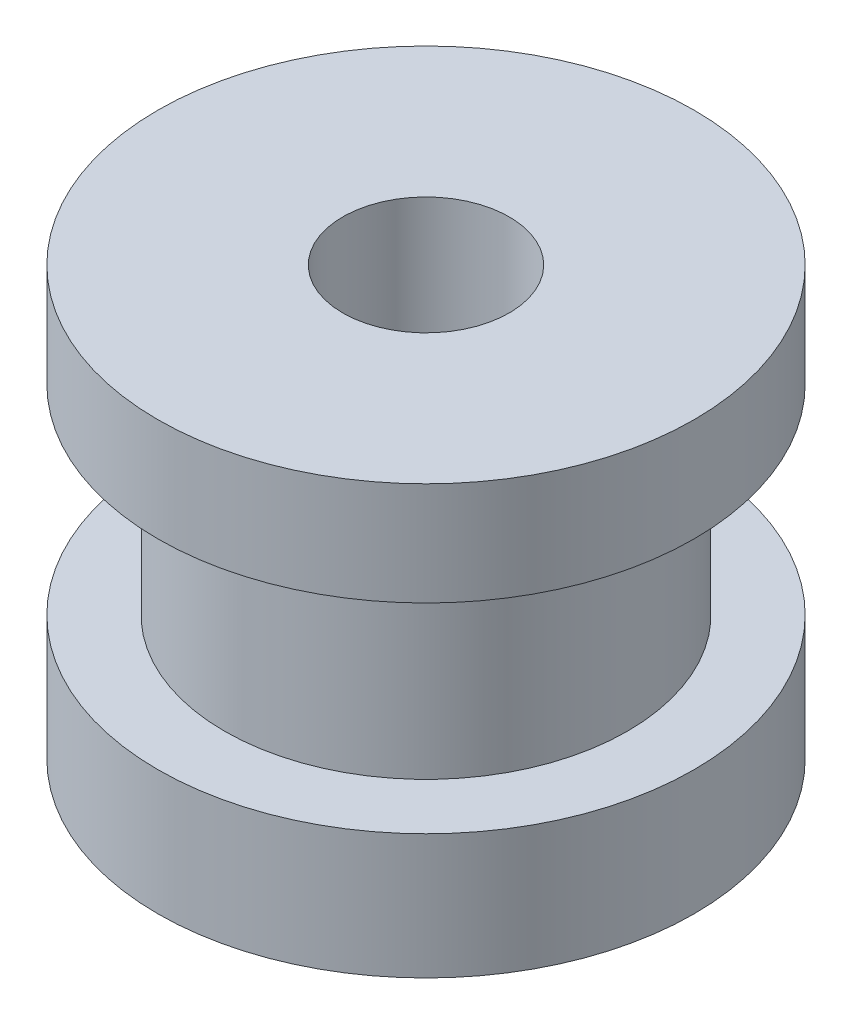
ISO-10303-21;
HEADER;
FILE_DESCRIPTION(('STEP AP214'),'2;1');
FILE_NAME('part.step','',(''),(''),'','','');
FILE_SCHEMA(('AUTOMOTIVE_DESIGN { 1 0 10303 214 1 1 1 1 }'));
ENDSEC;
DATA;
#1=APPLICATION_CONTEXT('core data for automotive mechanical design processes');
#2=APPLICATION_PROTOCOL_DEFINITION('international standard','automotive_design',2000,#1);
#3=PRODUCT_CONTEXT('',#1,'mechanical');
#4=PRODUCT('Part','Part','',(#3));
#5=PRODUCT_RELATED_PRODUCT_CATEGORY('part','',(#4));
#6=PRODUCT_DEFINITION_FORMATION('','',#4);
#7=PRODUCT_DEFINITION_CONTEXT('part definition',#1,'design');
#8=PRODUCT_DEFINITION('design','',#6,#7);
#9=PRODUCT_DEFINITION_SHAPE('','',#8);
#10=(LENGTH_UNIT() NAMED_UNIT(*) SI_UNIT(.MILLI.,.METRE.));
#11=(NAMED_UNIT(*) PLANE_ANGLE_UNIT() SI_UNIT($,.RADIAN.));
#12=(NAMED_UNIT(*) SI_UNIT($,.STERADIAN.) SOLID_ANGLE_UNIT());
#13=UNCERTAINTY_MEASURE_WITH_UNIT(LENGTH_MEASURE(1.E-05),#10,'distance_accuracy_value','');
#14=(GEOMETRIC_REPRESENTATION_CONTEXT(3) GLOBAL_UNCERTAINTY_ASSIGNED_CONTEXT((#13)) GLOBAL_UNIT_ASSIGNED_CONTEXT((#10,
#11,#12)) REPRESENTATION_CONTEXT('',''));
#15=CARTESIAN_POINT('',(0.,0.,0.));
#16=DIRECTION('',(0.,0.,1.));
#17=DIRECTION('',(1.,0.,0.));
#18=AXIS2_PLACEMENT_3D('',#15,#16,#17);
#19=CARTESIAN_POINT('',(0.,6.,0.));
#20=DIRECTION('',(0.,-1.,0.));
#21=DIRECTION('',(0.,0.,-1.));
#22=AXIS2_PLACEMENT_3D('',#19,#20,#21);
#23=CYLINDRICAL_SURFACE('',#22,2.1);
#24=CARTESIAN_POINT('',(0.,0.,0.));
#25=DIRECTION('',(0.,-1.,0.));
#26=DIRECTION('',(0.,0.,-1.));
#27=AXIS2_PLACEMENT_3D('',#24,#25,#26);
#28=CIRCLE('',#27,2.1);
#29=CARTESIAN_POINT('',(0.,0.,-2.1));
#30=VERTEX_POINT('',#29);
#31=EDGE_CURVE('E54',#30,#30,#28,.T.);
#32=ORIENTED_EDGE('',*,*,#31,.T.);
#33=EDGE_LOOP('',(#32));
#34=FACE_BOUND('',#33,.T.);
#35=CARTESIAN_POINT('',(0.,5.85,0.));
#36=DIRECTION('',(0.,1.,0.));
#37=DIRECTION('',(0.,0.,1.));
#38=AXIS2_PLACEMENT_3D('',#35,#36,#37);
#39=CIRCLE('',#38,2.1);
#40=CARTESIAN_POINT('',(0.,5.85,2.1));
#41=VERTEX_POINT('',#40);
#42=EDGE_CURVE('E34',#41,#41,#39,.F.);
#43=ORIENTED_EDGE('',*,*,#42,.F.);
#44=EDGE_LOOP('',(#43));
#45=FACE_BOUND('',#44,.T.);
#46=ADVANCED_FACE('F30',(#34,#45),#23,.F.);
#47=CARTESIAN_POINT('',(0.,3.75,0.));
#48=DIRECTION('',(0.,1.,0.));
#49=DIRECTION('',(0.,0.,1.));
#50=AXIS2_PLACEMENT_3D('',#47,#48,#49);
#51=PLANE('',#50);
#52=CARTESIAN_POINT('',(0.,3.75,0.));
#53=DIRECTION('',(0.,1.,0.));
#54=DIRECTION('',(0.,0.,1.));
#55=AXIS2_PLACEMENT_3D('',#52,#53,#54);
#56=CIRCLE('',#55,8.05);
#57=CARTESIAN_POINT('',(0.,3.75,8.05));
#58=VERTEX_POINT('',#57);
#59=EDGE_CURVE('E10',#58,#58,#56,.T.);
#60=ORIENTED_EDGE('',*,*,#59,.T.);
#61=EDGE_LOOP('',(#60));
#62=FACE_BOUND('',#61,.T.);
#63=CARTESIAN_POINT('',(0.,3.75,0.));
#64=DIRECTION('',(0.,1.,0.));
#65=DIRECTION('',(0.,0.,1.));
#66=AXIS2_PLACEMENT_3D('',#63,#64,#65);
#67=CIRCLE('',#66,6.05);
#68=CARTESIAN_POINT('',(0.,3.75,6.05));
#69=VERTEX_POINT('',#68);
#70=EDGE_CURVE('E45',#69,#69,#67,.T.);
#71=ORIENTED_EDGE('',*,*,#70,.F.);
#72=EDGE_LOOP('',(#71));
#73=FACE_BOUND('',#72,.T.);
#74=ADVANCED_FACE('F72',(#62,#73),#51,.T.);
#75=CARTESIAN_POINT('',(0.,3.75,0.));
#76=DIRECTION('',(0.,-1.,0.));
#77=DIRECTION('',(0.,0.,-1.));
#78=AXIS2_PLACEMENT_3D('',#75,#76,#77);
#79=CYLINDRICAL_SURFACE('',#78,8.05);
#80=ORIENTED_EDGE('',*,*,#59,.F.);
#81=EDGE_LOOP('',(#80));
#82=FACE_BOUND('',#81,.T.);
#83=CARTESIAN_POINT('',(0.,0.,0.));
#84=DIRECTION('',(0.,1.,0.));
#85=DIRECTION('',(0.,0.,1.));
#86=AXIS2_PLACEMENT_3D('',#83,#84,#85);
#87=CIRCLE('',#86,8.05);
#88=CARTESIAN_POINT('',(0.,0.,8.05));
#89=VERTEX_POINT('',#88);
#90=EDGE_CURVE('E38',#89,#89,#87,.T.);
#91=ORIENTED_EDGE('',*,*,#90,.T.);
#92=EDGE_LOOP('',(#91));
#93=FACE_BOUND('',#92,.T.);
#94=ADVANCED_FACE('F32',(#82,#93),#79,.T.);
#95=CARTESIAN_POINT('',(0.,0.,0.));
#96=DIRECTION('',(0.,1.,0.));
#97=DIRECTION('',(0.,0.,1.));
#98=AXIS2_PLACEMENT_3D('',#95,#96,#97);
#99=PLANE('',#98);
#100=ORIENTED_EDGE('',*,*,#31,.F.);
#101=EDGE_LOOP('',(#100));
#102=FACE_BOUND('',#101,.T.);
#103=ORIENTED_EDGE('',*,*,#90,.F.);
#104=EDGE_LOOP('',(#103));
#105=FACE_BOUND('',#104,.T.);
#106=ADVANCED_FACE('F97',(#102,#105),#99,.F.);
#107=CARTESIAN_POINT('',(0.,9.75,0.));
#108=DIRECTION('',(0.,-1.,0.));
#109=DIRECTION('',(0.,0.,-1.));
#110=AXIS2_PLACEMENT_3D('',#107,#108,#109);
#111=CYLINDRICAL_SURFACE('',#110,6.05);
#112=CARTESIAN_POINT('',(0.,9.75,0.));
#113=DIRECTION('',(0.,1.,0.));
#114=DIRECTION('',(0.,0.,1.));
#115=AXIS2_PLACEMENT_3D('',#112,#113,#114);
#116=CIRCLE('',#115,6.05);
#117=CARTESIAN_POINT('',(0.,9.75,6.05));
#118=VERTEX_POINT('',#117);
#119=EDGE_CURVE('E43',#118,#118,#116,.T.);
#120=ORIENTED_EDGE('',*,*,#119,.F.);
#121=EDGE_LOOP('',(#120));
#122=FACE_BOUND('',#121,.T.);
#123=ORIENTED_EDGE('',*,*,#70,.T.);
#124=EDGE_LOOP('',(#123));
#125=FACE_BOUND('',#124,.T.);
#126=ADVANCED_FACE('F91',(#122,#125),#111,.T.);
#127=CARTESIAN_POINT('',(0.,9.75,0.));
#128=DIRECTION('',(0.,1.,0.));
#129=DIRECTION('',(0.,0.,1.));
#130=AXIS2_PLACEMENT_3D('',#127,#128,#129);
#131=PLANE('',#130);
#132=CARTESIAN_POINT('',(0.,9.75,0.));
#133=DIRECTION('',(0.,1.,0.));
#134=DIRECTION('',(0.,0.,1.));
#135=AXIS2_PLACEMENT_3D('',#132,#133,#134);
#136=CIRCLE('',#135,8.05);
#137=CARTESIAN_POINT('',(0.,9.75,-8.05));
#138=VERTEX_POINT('',#137);
#139=EDGE_CURVE('E51',#138,#138,#136,.T.);
#140=ORIENTED_EDGE('',*,*,#139,.F.);
#141=EDGE_LOOP('',(#140));
#142=FACE_BOUND('',#141,.T.);
#143=ORIENTED_EDGE('',*,*,#119,.T.);
#144=EDGE_LOOP('',(#143));
#145=FACE_BOUND('',#144,.T.);
#146=ADVANCED_FACE('F88',(#142,#145),#131,.F.);
#147=CARTESIAN_POINT('',(0.,12.85,0.));
#148=DIRECTION('',(0.,-1.,0.));
#149=DIRECTION('',(0.,0.,-1.));
#150=AXIS2_PLACEMENT_3D('',#147,#148,#149);
#151=CYLINDRICAL_SURFACE('',#150,8.05);
#152=CARTESIAN_POINT('',(0.,12.85,0.));
#153=DIRECTION('',(0.,1.,0.));
#154=DIRECTION('',(0.,0.,1.));
#155=AXIS2_PLACEMENT_3D('',#152,#153,#154);
#156=CIRCLE('',#155,8.05);
#157=CARTESIAN_POINT('',(0.,12.85,-8.05));
#158=VERTEX_POINT('',#157);
#159=EDGE_CURVE('E48',#158,#158,#156,.T.);
#160=CARTESIAN_POINT('',(0.,12.85,-8.05));
#161=CARTESIAN_POINT('',(0.,12.8177083333333,-8.05));
#162=CARTESIAN_POINT('',(0.,12.7854166666667,-8.05));
#163=CARTESIAN_POINT('',(0.,12.7208333333333,-8.05));
#164=CARTESIAN_POINT('',(0.,12.6885416666667,-8.05));
#165=CARTESIAN_POINT('',(0.,12.6239583333333,-8.05));
#166=CARTESIAN_POINT('',(0.,12.5916666666667,-8.05));
#167=CARTESIAN_POINT('',(0.,12.5270833333333,-8.05));
#168=CARTESIAN_POINT('',(0.,12.4947916666667,-8.05));
#169=CARTESIAN_POINT('',(0.,12.4302083333333,-8.05));
#170=CARTESIAN_POINT('',(0.,12.3979166666667,-8.05));
#171=CARTESIAN_POINT('',(0.,12.3333333333333,-8.05));
#172=CARTESIAN_POINT('',(0.,12.3010416666667,-8.05));
#173=CARTESIAN_POINT('',(0.,12.2364583333333,-8.05));
#174=CARTESIAN_POINT('',(0.,12.2041666666667,-8.05));
#175=CARTESIAN_POINT('',(0.,12.1395833333333,-8.05));
#176=CARTESIAN_POINT('',(0.,12.1072916666667,-8.05));
#177=CARTESIAN_POINT('',(0.,12.0427083333333,-8.05));
#178=CARTESIAN_POINT('',(0.,12.0104166666667,-8.05));
#179=CARTESIAN_POINT('',(0.,11.9458333333333,-8.05));
#180=CARTESIAN_POINT('',(0.,11.9135416666667,-8.05));
#181=CARTESIAN_POINT('',(0.,11.8489583333333,-8.05));
#182=CARTESIAN_POINT('',(0.,11.8166666666667,-8.05));
#183=CARTESIAN_POINT('',(0.,11.7520833333333,-8.05));
#184=CARTESIAN_POINT('',(0.,11.7197916666667,-8.05));
#185=CARTESIAN_POINT('',(0.,11.6552083333333,-8.05));
#186=CARTESIAN_POINT('',(0.,11.6229166666667,-8.05));
#187=CARTESIAN_POINT('',(0.,11.5583333333333,-8.05));
#188=CARTESIAN_POINT('',(0.,11.5260416666667,-8.05));
#189=CARTESIAN_POINT('',(0.,11.4614583333333,-8.05));
#190=CARTESIAN_POINT('',(0.,11.4291666666667,-8.05));
#191=CARTESIAN_POINT('',(0.,11.3645833333333,-8.05));
#192=CARTESIAN_POINT('',(0.,11.3322916666667,-8.05));
#193=CARTESIAN_POINT('',(0.,11.2677083333333,-8.05));
#194=CARTESIAN_POINT('',(0.,11.2354166666667,-8.05));
#195=CARTESIAN_POINT('',(0.,11.1708333333333,-8.05));
#196=CARTESIAN_POINT('',(0.,11.1385416666667,-8.05));
#197=CARTESIAN_POINT('',(0.,11.0739583333333,-8.05));
#198=CARTESIAN_POINT('',(0.,11.0416666666667,-8.05));
#199=CARTESIAN_POINT('',(0.,10.9770833333333,-8.05));
#200=CARTESIAN_POINT('',(0.,10.9447916666667,-8.05));
#201=CARTESIAN_POINT('',(0.,10.8802083333333,-8.05));
#202=CARTESIAN_POINT('',(0.,10.8479166666667,-8.05));
#203=CARTESIAN_POINT('',(0.,10.7833333333333,-8.05));
#204=CARTESIAN_POINT('',(0.,10.7510416666667,-8.05));
#205=CARTESIAN_POINT('',(0.,10.6864583333333,-8.05));
#206=CARTESIAN_POINT('',(0.,10.6541666666667,-8.05));
#207=CARTESIAN_POINT('',(0.,10.5895833333333,-8.05));
#208=CARTESIAN_POINT('',(0.,10.5572916666667,-8.05));
#209=CARTESIAN_POINT('',(0.,10.4927083333333,-8.05));
#210=CARTESIAN_POINT('',(0.,10.4604166666667,-8.05));
#211=CARTESIAN_POINT('',(0.,10.3958333333333,-8.05));
#212=CARTESIAN_POINT('',(0.,10.3635416666667,-8.05));
#213=CARTESIAN_POINT('',(0.,10.2989583333333,-8.05));
#214=CARTESIAN_POINT('',(0.,10.2666666666667,-8.05));
#215=CARTESIAN_POINT('',(0.,10.2020833333333,-8.05));
#216=CARTESIAN_POINT('',(0.,10.1697916666667,-8.05));
#217=CARTESIAN_POINT('',(0.,10.1052083333333,-8.05));
#218=CARTESIAN_POINT('',(0.,10.0729166666667,-8.05));
#219=CARTESIAN_POINT('',(0.,10.0083333333333,-8.05));
#220=CARTESIAN_POINT('',(0.,9.97604166666667,-8.05));
#221=CARTESIAN_POINT('',(0.,9.91145833333333,-8.05));
#222=CARTESIAN_POINT('',(0.,9.87916666666667,-8.05));
#223=CARTESIAN_POINT('',(0.,9.81458333333333,-8.05));
#224=CARTESIAN_POINT('',(0.,9.78229166666667,-8.05));
#225=CARTESIAN_POINT('',(0.,9.75,-8.05));
#226=B_SPLINE_CURVE_WITH_KNOTS('',3,(#160,#161,#162,#163,#164,#165,#166,#167,#168,#169,#170,
#171,#172,#173,#174,#175,#176,#177,#178,#179,#180,#181,#182,#183,#184,#185,#186,#187,#188,#189,
#190,#191,#192,#193,#194,#195,#196,#197,#198,#199,#200,#201,#202,#203,#204,#205,#206,#207,#208,
#209,#210,#211,#212,#213,#214,#215,#216,#217,#218,#219,#220,#221,#222,#223,#224,#225),
.UNSPECIFIED.,.F.,.F.,(4,2,2,2,2,2,2,2,2,2,2,2,2,2,2,2,2,2,2,2,2,2,2,2,2,2,2,2,2,2,2,2,4),(0.,
0.0968749999999997,0.193749999999999,0.290624999999999,0.387499999999999,0.484374999999999,
0.581249999999998,0.678125,0.775,0.871874999999999,0.968749999999999,1.065625,1.1625,1.259375,
1.35625,1.453125,1.55,1.646875,1.74375,1.840625,1.9375,2.034375,2.13125,2.228125,2.325,2.421875,
2.51875,2.615625,2.7125,2.809375,2.90625,3.003125,3.1),.UNSPECIFIED.);
#227=EDGE_CURVE('BSEAM86',#158,#138,#226,.T.);
#228=ORIENTED_EDGE('',*,*,#159,.F.);
#229=ORIENTED_EDGE('',*,*,#139,.T.);
#230=ORIENTED_EDGE('',*,*,#227,.T.);
#231=ORIENTED_EDGE('',*,*,#227,.F.);
#232=EDGE_LOOP('',(#228,#230,#229,#231));
#233=FACE_BOUND('',#232,.T.);
#234=ADVANCED_FACE('F86',(#233),#151,.T.);
#235=CARTESIAN_POINT('',(0.,12.85,0.));
#236=DIRECTION('',(0.,1.,0.));
#237=DIRECTION('',(0.,0.,1.));
#238=AXIS2_PLACEMENT_3D('',#235,#236,#237);
#239=PLANE('',#238);
#240=CARTESIAN_POINT('',(0.,12.85,0.));
#241=DIRECTION('',(0.,1.,0.));
#242=DIRECTION('',(0.,0.,1.));
#243=AXIS2_PLACEMENT_3D('',#240,#241,#242);
#244=CIRCLE('',#243,2.5);
#245=CARTESIAN_POINT('',(0.,12.85,2.5));
#246=VERTEX_POINT('',#245);
#247=EDGE_CURVE('E59',#246,#246,#244,.T.);
#248=ORIENTED_EDGE('',*,*,#247,.F.);
#249=EDGE_LOOP('',(#248));
#250=FACE_BOUND('',#249,.T.);
#251=ORIENTED_EDGE('',*,*,#159,.T.);
#252=EDGE_LOOP('',(#251));
#253=FACE_BOUND('',#252,.T.);
#254=ADVANCED_FACE('F83',(#250,#253),#239,.T.);
#255=CARTESIAN_POINT('',(0.,5.85,0.));
#256=DIRECTION('',(0.,1.,0.));
#257=DIRECTION('',(0.,0.,1.));
#258=AXIS2_PLACEMENT_3D('',#255,#256,#257);
#259=PLANE('',#258);
#260=CARTESIAN_POINT('',(0.,5.85,0.));
#261=DIRECTION('',(0.,1.,0.));
#262=DIRECTION('',(0.,0.,1.));
#263=AXIS2_PLACEMENT_3D('',#260,#261,#262);
#264=CIRCLE('',#263,2.5);
#265=CARTESIAN_POINT('',(0.,5.85,2.5));
#266=VERTEX_POINT('',#265);
#267=EDGE_CURVE('E62',#266,#266,#264,.T.);
#268=ORIENTED_EDGE('',*,*,#267,.T.);
#269=EDGE_LOOP('',(#268));
#270=FACE_BOUND('',#269,.T.);
#271=ORIENTED_EDGE('',*,*,#42,.T.);
#272=EDGE_LOOP('',(#271));
#273=FACE_BOUND('',#272,.T.);
#274=ADVANCED_FACE('F69',(#270,#273),#259,.T.);
#275=CARTESIAN_POINT('',(0.,5.85,0.));
#276=DIRECTION('',(0.,1.,0.));
#277=DIRECTION('',(0.,0.,1.));
#278=AXIS2_PLACEMENT_3D('',#275,#276,#277);
#279=CYLINDRICAL_SURFACE('',#278,2.5);
#280=ORIENTED_EDGE('',*,*,#267,.F.);
#281=EDGE_LOOP('',(#280));
#282=FACE_BOUND('',#281,.T.);
#283=ORIENTED_EDGE('',*,*,#247,.T.);
#284=EDGE_LOOP('',(#283));
#285=FACE_BOUND('',#284,.T.);
#286=ADVANCED_FACE('F81',(#282,#285),#279,.F.);
#287=CLOSED_SHELL('',(#46,#74,#94,#106,#126,#146,#234,#254,#274,#286));
#288=MANIFOLD_SOLID_BREP('B2',#287);
#289=ADVANCED_BREP_SHAPE_REPRESENTATION('',(#18,#288),#14);
#290=SHAPE_DEFINITION_REPRESENTATION(#9,#289);
ENDSEC;
END-ISO-10303-21;
